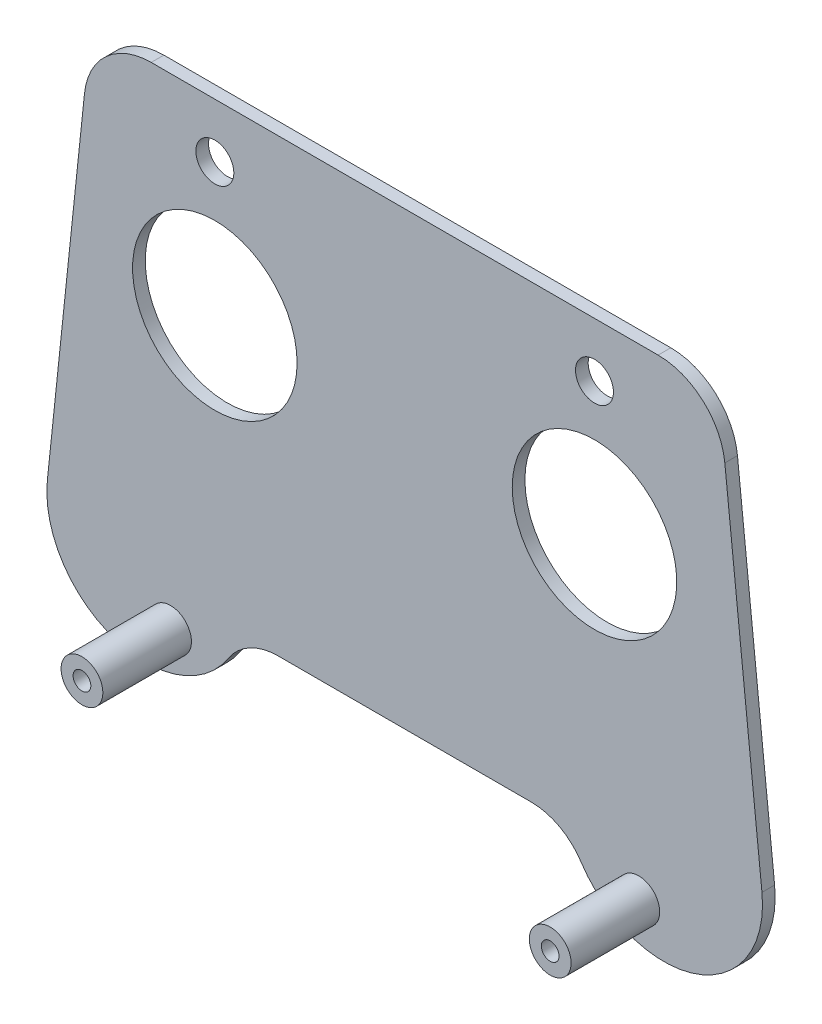
ISO-10303-21;
HEADER;
FILE_DESCRIPTION(('STEP AP214'),'2;1');
FILE_NAME('part.step','',(''),(''),'','','');
FILE_SCHEMA(('AUTOMOTIVE_DESIGN { 1 0 10303 214 1 1 1 1 }'));
ENDSEC;
DATA;
#1=APPLICATION_CONTEXT('core data for automotive mechanical design processes');
#2=APPLICATION_PROTOCOL_DEFINITION('international standard','automotive_design',2000,#1);
#3=PRODUCT_CONTEXT('',#1,'mechanical');
#4=PRODUCT('Part','Part','',(#3));
#5=PRODUCT_RELATED_PRODUCT_CATEGORY('part','',(#4));
#6=PRODUCT_DEFINITION_FORMATION('','',#4);
#7=PRODUCT_DEFINITION_CONTEXT('part definition',#1,'design');
#8=PRODUCT_DEFINITION('design','',#6,#7);
#9=PRODUCT_DEFINITION_SHAPE('','',#8);
#10=(LENGTH_UNIT() NAMED_UNIT(*) SI_UNIT(.MILLI.,.METRE.));
#11=(NAMED_UNIT(*) PLANE_ANGLE_UNIT() SI_UNIT($,.RADIAN.));
#12=(NAMED_UNIT(*) SI_UNIT($,.STERADIAN.) SOLID_ANGLE_UNIT());
#13=UNCERTAINTY_MEASURE_WITH_UNIT(LENGTH_MEASURE(1.E-05),#10,'distance_accuracy_value','');
#14=(GEOMETRIC_REPRESENTATION_CONTEXT(3) GLOBAL_UNCERTAINTY_ASSIGNED_CONTEXT((#13)) GLOBAL_UNIT_ASSIGNED_CONTEXT((#10,
#11,#12)) REPRESENTATION_CONTEXT('',''));
#15=CARTESIAN_POINT('',(0.,0.,0.));
#16=DIRECTION('',(0.,0.,1.));
#17=DIRECTION('',(1.,0.,0.));
#18=AXIS2_PLACEMENT_3D('',#15,#16,#17);
#19=CARTESIAN_POINT('',(30.5870328280948,18.8291806062269,2.));
#20=DIRECTION('',(0.,0.,1.));
#21=DIRECTION('',(1.,0.,0.));
#22=AXIS2_PLACEMENT_3D('',#19,#20,#21);
#23=PLANE('',#22);
#24=CARTESIAN_POINT('',(27.5322517817776,-46.6708193937731,2.));
#25=DIRECTION('',(0.,0.,1.));
#26=DIRECTION('',(-1.,0.,0.));
#27=AXIS2_PLACEMENT_3D('',#24,#25,#26);
#28=CIRCLE('',#27,3.3);
#29=CARTESIAN_POINT('',(24.2322517817776,-46.6708193937731,2.));
#30=VERTEX_POINT('',#29);
#31=EDGE_CURVE('E242',#30,#30,#28,.T.);
#32=ORIENTED_EDGE('',*,*,#31,.F.);
#33=EDGE_LOOP('',(#32));
#34=FACE_BOUND('',#33,.T.);
#35=CARTESIAN_POINT('',(-46.4677482182224,-46.6708193937731,2.));
#36=DIRECTION('',(0.,0.,1.));
#37=DIRECTION('',(1.,0.,0.));
#38=AXIS2_PLACEMENT_3D('',#35,#36,#37);
#39=CIRCLE('',#38,3.3);
#40=CARTESIAN_POINT('',(-43.1677482182224,-46.6708193937731,2.));
#41=VERTEX_POINT('',#40);
#42=EDGE_CURVE('E236',#41,#41,#39,.T.);
#43=ORIENTED_EDGE('',*,*,#42,.F.);
#44=EDGE_LOOP('',(#43));
#45=FACE_BOUND('',#44,.T.);
#46=CARTESIAN_POINT('',(20.5322517817776,-0.170819393773065,2.));
#47=DIRECTION('',(0.,0.,1.));
#48=DIRECTION('',(-1.,0.,0.));
#49=AXIS2_PLACEMENT_3D('',#46,#47,#48);
#50=CIRCLE('',#49,13.);
#51=CARTESIAN_POINT('',(7.53225178177759,-0.170819393773065,2.));
#52=VERTEX_POINT('',#51);
#53=EDGE_CURVE('E221',#52,#52,#50,.T.);
#54=ORIENTED_EDGE('',*,*,#53,.F.);
#55=EDGE_LOOP('',(#54));
#56=FACE_BOUND('',#55,.T.);
#57=CARTESIAN_POINT('',(-39.4677482182224,-0.170819393773072,2.));
#58=DIRECTION('',(0.,0.,1.));
#59=DIRECTION('',(1.,0.,0.));
#60=AXIS2_PLACEMENT_3D('',#57,#58,#59);
#61=CIRCLE('',#60,13.);
#62=CARTESIAN_POINT('',(-26.4677482182224,-0.170819393773072,2.));
#63=VERTEX_POINT('',#62);
#64=EDGE_CURVE('E149',#63,#63,#61,.T.);
#65=ORIENTED_EDGE('',*,*,#64,.F.);
#66=EDGE_LOOP('',(#65));
#67=FACE_BOUND('',#66,.T.);
#68=CARTESIAN_POINT('',(30.5870328280948,18.8291806062269,2.));
#69=DIRECTION('',(0.,0.,1.));
#70=DIRECTION('',(1.,0.,0.));
#71=AXIS2_PLACEMENT_3D('',#68,#69,#70);
#72=CIRCLE('',#71,10.6);
#73=CARTESIAN_POINT('',(41.1289649189985,19.937182316864,2.));
#74=VERTEX_POINT('',#73);
#75=CARTESIAN_POINT('',(30.5870328280948,29.4291806062269,2.));
#76=VERTEX_POINT('',#75);
#77=EDGE_CURVE('E164',#74,#76,#72,.T.);
#78=ORIENTED_EDGE('',*,*,#77,.T.);
#79=DIRECTION('',(-1.,0.,0.));
#80=VECTOR('',#79,1.);
#81=CARTESIAN_POINT('',(30.5870328280948,29.4291806062269,2.));
#82=LINE('',#81,#80);
#83=CARTESIAN_POINT('',(-49.5225292645397,29.4291806062269,2.));
#84=VERTEX_POINT('',#83);
#85=EDGE_CURVE('E102',#76,#84,#82,.T.);
#86=ORIENTED_EDGE('',*,*,#85,.T.);
#87=CARTESIAN_POINT('',(-49.5225292645397,18.8291806062269,2.));
#88=DIRECTION('',(0.,0.,1.));
#89=DIRECTION('',(-1.,0.,0.));
#90=AXIS2_PLACEMENT_3D('',#87,#88,#89);
#91=CIRCLE('',#90,10.6);
#92=CARTESIAN_POINT('',(-60.0644613554434,19.937182316864,2.));
#93=VERTEX_POINT('',#92);
#94=EDGE_CURVE('E185',#84,#93,#91,.T.);
#95=ORIENTED_EDGE('',*,*,#94,.T.);
#96=DIRECTION('',(-0.104528463267651,-0.994521895368274,0.));
#97=VECTOR('',#96,1.);
#98=CARTESIAN_POINT('',(-60.0644613554434,19.937182316864,2.));
#99=LINE('',#98,#97);
#100=CARTESIAN_POINT('',(-65.9331597594666,-35.8997531709289,2.));
#101=VERTEX_POINT('',#100);
#102=EDGE_CURVE('E204',#93,#101,#99,.T.);
#103=ORIENTED_EDGE('',*,*,#102,.T.);
#104=CARTESIAN_POINT('',(-50.4186181917215,-37.5303971979043,2.));
#105=DIRECTION('',(0.,0.,1.));
#106=DIRECTION('',(1.,0.,0.));
#107=AXIS2_PLACEMENT_3D('',#104,#105,#106);
#108=CIRCLE('',#107,15.6);
#109=CARTESIAN_POINT('',(-37.3452763755817,-46.0420206481264,2.));
#110=VERTEX_POINT('',#109);
#111=EDGE_CURVE('E201',#101,#110,#108,.T.);
#112=ORIENTED_EDGE('',*,*,#111,.T.);
#113=CARTESIAN_POINT('',(-29.4677498966257,-51.1708193937731,2.));
#114=DIRECTION('',(0.,0.,-1.));
#115=DIRECTION('',(1.,0.,0.));
#116=AXIS2_PLACEMENT_3D('',#113,#114,#115);
#117=CIRCLE('',#116,9.40000000000001);
#118=CARTESIAN_POINT('',(-29.4677498966257,-41.7708193937731,2.));
#119=VERTEX_POINT('',#118);
#120=EDGE_CURVE('E203',#110,#119,#117,.T.);
#121=ORIENTED_EDGE('',*,*,#120,.T.);
#122=DIRECTION('',(1.,0.,0.));
#123=VECTOR('',#122,1.);
#124=CARTESIAN_POINT('',(-29.4677498966257,-41.7708193937731,2.));
#125=LINE('',#124,#123);
#126=CARTESIAN_POINT('',(10.5322534601809,-41.7708193937731,2.));
#127=VERTEX_POINT('',#126);
#128=EDGE_CURVE('E127',#119,#127,#125,.T.);
#129=ORIENTED_EDGE('',*,*,#128,.T.);
#130=CARTESIAN_POINT('',(10.5322534601809,-51.1708193937731,2.));
#131=DIRECTION('',(0.,0.,-1.));
#132=DIRECTION('',(-1.,0.,0.));
#133=AXIS2_PLACEMENT_3D('',#130,#131,#132);
#134=CIRCLE('',#133,9.40000000000001);
#135=CARTESIAN_POINT('',(18.4097799391369,-46.0420206481264,2.));
#136=VERTEX_POINT('',#135);
#137=EDGE_CURVE('E121',#127,#136,#134,.T.);
#138=ORIENTED_EDGE('',*,*,#137,.T.);
#139=CARTESIAN_POINT('',(31.4831217552767,-37.5303971979043,2.));
#140=DIRECTION('',(0.,0.,1.));
#141=DIRECTION('',(-1.,0.,0.));
#142=AXIS2_PLACEMENT_3D('',#139,#140,#141);
#143=CIRCLE('',#142,15.6);
#144=CARTESIAN_POINT('',(46.9976633230217,-35.8997531709289,2.));
#145=VERTEX_POINT('',#144);
#146=EDGE_CURVE('E125',#136,#145,#143,.T.);
#147=ORIENTED_EDGE('',*,*,#146,.T.);
#148=DIRECTION('',(-0.104528463267651,0.994521895368274,0.));
#149=VECTOR('',#148,1.);
#150=CARTESIAN_POINT('',(41.1289649189985,19.937182316864,2.));
#151=LINE('',#150,#149);
#152=EDGE_CURVE('E53',#145,#74,#151,.T.);
#153=ORIENTED_EDGE('',*,*,#152,.T.);
#154=EDGE_LOOP('',(#78,#86,#95,#103,#112,#121,#129,#138,#147,#153));
#155=FACE_BOUND('',#154,.T.);
#156=CARTESIAN_POINT('',(-39.4677482182224,20.8291806062269,2.));
#157=DIRECTION('',(0.,0.,1.));
#158=DIRECTION('',(1.,0.,0.));
#159=AXIS2_PLACEMENT_3D('',#156,#157,#158);
#160=CIRCLE('',#159,3.);
#161=CARTESIAN_POINT('',(-36.4677482182224,20.8291806062269,2.));
#162=VERTEX_POINT('',#161);
#163=EDGE_CURVE('E215',#162,#162,#160,.T.);
#164=ORIENTED_EDGE('',*,*,#163,.F.);
#165=EDGE_LOOP('',(#164));
#166=FACE_BOUND('',#165,.T.);
#167=CARTESIAN_POINT('',(20.5322517817776,20.8291806062269,2.));
#168=DIRECTION('',(0.,0.,1.));
#169=DIRECTION('',(-1.,0.,0.));
#170=AXIS2_PLACEMENT_3D('',#167,#168,#169);
#171=CIRCLE('',#170,3.);
#172=CARTESIAN_POINT('',(17.5322517817776,20.8291806062269,2.));
#173=VERTEX_POINT('',#172);
#174=EDGE_CURVE('E227',#173,#173,#171,.T.);
#175=ORIENTED_EDGE('',*,*,#174,.F.);
#176=EDGE_LOOP('',(#175));
#177=FACE_BOUND('',#176,.T.);
#178=ADVANCED_FACE('F36',(#34,#45,#56,#67,#155,#166,#177),#23,.T.);
#179=CARTESIAN_POINT('',(30.5870328280948,18.8291806062269,0.));
#180=DIRECTION('',(0.,0.,1.));
#181=DIRECTION('',(1.,0.,0.));
#182=AXIS2_PLACEMENT_3D('',#179,#180,#181);
#183=PLANE('',#182);
#184=CARTESIAN_POINT('',(30.5870328280948,18.8291806062269,0.));
#185=DIRECTION('',(0.,0.,1.));
#186=DIRECTION('',(1.,0.,0.));
#187=AXIS2_PLACEMENT_3D('',#184,#185,#186);
#188=CIRCLE('',#187,10.6);
#189=CARTESIAN_POINT('',(41.1289649189985,19.937182316864,0.));
#190=VERTEX_POINT('',#189);
#191=CARTESIAN_POINT('',(30.5870328280948,29.4291806062269,0.));
#192=VERTEX_POINT('',#191);
#193=EDGE_CURVE('E145',#190,#192,#188,.T.);
#194=ORIENTED_EDGE('',*,*,#193,.F.);
#195=DIRECTION('',(-0.104528463267651,0.994521895368274,0.));
#196=VECTOR('',#195,1.);
#197=CARTESIAN_POINT('',(41.1289649189985,19.937182316864,0.));
#198=LINE('',#197,#196);
#199=CARTESIAN_POINT('',(46.9976633230217,-35.8997531709289,0.));
#200=VERTEX_POINT('',#199);
#201=EDGE_CURVE('E94',#200,#190,#198,.T.);
#202=ORIENTED_EDGE('',*,*,#201,.F.);
#203=CARTESIAN_POINT('',(31.4831217552767,-37.5303971979043,0.));
#204=DIRECTION('',(0.,0.,1.));
#205=DIRECTION('',(-1.,0.,0.));
#206=AXIS2_PLACEMENT_3D('',#203,#204,#205);
#207=CIRCLE('',#206,15.6);
#208=CARTESIAN_POINT('',(18.4097799391369,-46.0420206481264,0.));
#209=VERTEX_POINT('',#208);
#210=EDGE_CURVE('E88',#209,#200,#207,.T.);
#211=ORIENTED_EDGE('',*,*,#210,.F.);
#212=CARTESIAN_POINT('',(10.5322534601809,-51.1708193937731,0.));
#213=DIRECTION('',(0.,0.,-1.));
#214=DIRECTION('',(-1.,0.,0.));
#215=AXIS2_PLACEMENT_3D('',#212,#213,#214);
#216=CIRCLE('',#215,9.40000000000001);
#217=CARTESIAN_POINT('',(10.5322534601809,-41.7708193937731,0.));
#218=VERTEX_POINT('',#217);
#219=EDGE_CURVE('E135',#218,#209,#216,.T.);
#220=ORIENTED_EDGE('',*,*,#219,.F.);
#221=DIRECTION('',(1.,0.,0.));
#222=VECTOR('',#221,1.);
#223=CARTESIAN_POINT('',(-29.4677498966257,-41.7708193937731,0.));
#224=LINE('',#223,#222);
#225=CARTESIAN_POINT('',(-29.4677498966257,-41.7708193937731,0.));
#226=VERTEX_POINT('',#225);
#227=EDGE_CURVE('E159',#226,#218,#224,.T.);
#228=ORIENTED_EDGE('',*,*,#227,.F.);
#229=CARTESIAN_POINT('',(-29.4677498966257,-51.1708193937731,0.));
#230=DIRECTION('',(0.,0.,-1.));
#231=DIRECTION('',(1.,0.,0.));
#232=AXIS2_PLACEMENT_3D('',#229,#230,#231);
#233=CIRCLE('',#232,9.40000000000001);
#234=CARTESIAN_POINT('',(-37.3452763755817,-46.0420206481264,0.));
#235=VERTEX_POINT('',#234);
#236=EDGE_CURVE('E157',#235,#226,#233,.T.);
#237=ORIENTED_EDGE('',*,*,#236,.F.);
#238=CARTESIAN_POINT('',(-50.4186181917215,-37.5303971979043,0.));
#239=DIRECTION('',(0.,0.,1.));
#240=DIRECTION('',(1.,0.,0.));
#241=AXIS2_PLACEMENT_3D('',#238,#239,#240);
#242=CIRCLE('',#241,15.6);
#243=CARTESIAN_POINT('',(-65.9331597594666,-35.8997531709289,0.));
#244=VERTEX_POINT('',#243);
#245=EDGE_CURVE('E155',#244,#235,#242,.T.);
#246=ORIENTED_EDGE('',*,*,#245,.F.);
#247=DIRECTION('',(-0.104528463267651,-0.994521895368274,0.));
#248=VECTOR('',#247,1.);
#249=CARTESIAN_POINT('',(-60.0644613554434,19.937182316864,0.));
#250=LINE('',#249,#248);
#251=CARTESIAN_POINT('',(-60.0644613554434,19.937182316864,0.));
#252=VERTEX_POINT('',#251);
#253=EDGE_CURVE('E153',#252,#244,#250,.T.);
#254=ORIENTED_EDGE('',*,*,#253,.F.);
#255=CARTESIAN_POINT('',(-49.5225292645397,18.8291806062269,0.));
#256=DIRECTION('',(0.,0.,1.));
#257=DIRECTION('',(-1.,0.,0.));
#258=AXIS2_PLACEMENT_3D('',#255,#256,#257);
#259=CIRCLE('',#258,10.6);
#260=CARTESIAN_POINT('',(-49.5225292645397,29.4291806062269,0.));
#261=VERTEX_POINT('',#260);
#262=EDGE_CURVE('E151',#261,#252,#259,.T.);
#263=ORIENTED_EDGE('',*,*,#262,.F.);
#264=DIRECTION('',(-1.,0.,0.));
#265=VECTOR('',#264,1.);
#266=CARTESIAN_POINT('',(30.5870328280948,29.4291806062269,0.));
#267=LINE('',#266,#265);
#268=EDGE_CURVE('E148',#192,#261,#267,.T.);
#269=ORIENTED_EDGE('',*,*,#268,.F.);
#270=EDGE_LOOP('',(#194,#202,#211,#220,#228,#237,#246,#254,#263,#269));
#271=FACE_BOUND('',#270,.T.);
#272=CARTESIAN_POINT('',(-39.4677482182224,-0.170819393773072,0.));
#273=DIRECTION('',(0.,0.,1.));
#274=DIRECTION('',(1.,0.,0.));
#275=AXIS2_PLACEMENT_3D('',#272,#273,#274);
#276=CIRCLE('',#275,13.);
#277=CARTESIAN_POINT('',(-26.4677482182224,-0.170819393773072,0.));
#278=VERTEX_POINT('',#277);
#279=EDGE_CURVE('E212',#278,#278,#276,.T.);
#280=ORIENTED_EDGE('',*,*,#279,.T.);
#281=EDGE_LOOP('',(#280));
#282=FACE_BOUND('',#281,.T.);
#283=CARTESIAN_POINT('',(-39.4677482182224,20.8291806062269,0.));
#284=DIRECTION('',(0.,0.,1.));
#285=DIRECTION('',(1.,0.,0.));
#286=AXIS2_PLACEMENT_3D('',#283,#284,#285);
#287=CIRCLE('',#286,3.);
#288=CARTESIAN_POINT('',(-36.4677482182224,20.8291806062269,0.));
#289=VERTEX_POINT('',#288);
#290=EDGE_CURVE('E218',#289,#289,#287,.T.);
#291=ORIENTED_EDGE('',*,*,#290,.T.);
#292=EDGE_LOOP('',(#291));
#293=FACE_BOUND('',#292,.T.);
#294=CARTESIAN_POINT('',(20.5322517817776,-0.170819393773065,0.));
#295=DIRECTION('',(0.,0.,1.));
#296=DIRECTION('',(-1.,0.,0.));
#297=AXIS2_PLACEMENT_3D('',#294,#295,#296);
#298=CIRCLE('',#297,13.);
#299=CARTESIAN_POINT('',(7.53225178177759,-0.170819393773065,0.));
#300=VERTEX_POINT('',#299);
#301=EDGE_CURVE('E224',#300,#300,#298,.T.);
#302=ORIENTED_EDGE('',*,*,#301,.T.);
#303=EDGE_LOOP('',(#302));
#304=FACE_BOUND('',#303,.T.);
#305=CARTESIAN_POINT('',(20.5322517817776,20.8291806062269,0.));
#306=DIRECTION('',(0.,0.,1.));
#307=DIRECTION('',(-1.,0.,0.));
#308=AXIS2_PLACEMENT_3D('',#305,#306,#307);
#309=CIRCLE('',#308,3.);
#310=CARTESIAN_POINT('',(17.5322517817776,20.8291806062269,0.));
#311=VERTEX_POINT('',#310);
#312=EDGE_CURVE('E230',#311,#311,#309,.T.);
#313=ORIENTED_EDGE('',*,*,#312,.T.);
#314=EDGE_LOOP('',(#313));
#315=FACE_BOUND('',#314,.T.);
#316=ADVANCED_FACE('F189',(#271,#282,#293,#304,#315),#183,.F.);
#317=CARTESIAN_POINT('',(30.5870328280948,18.8291806062269,2.));
#318=DIRECTION('',(0.,0.,-1.));
#319=DIRECTION('',(-1.,0.,0.));
#320=AXIS2_PLACEMENT_3D('',#317,#318,#319);
#321=CYLINDRICAL_SURFACE('',#320,10.6);
#322=ORIENTED_EDGE('',*,*,#193,.T.);
#323=DIRECTION('',(0.,0.,-1.));
#324=VECTOR('',#323,1.);
#325=CARTESIAN_POINT('',(30.5870328280948,29.4291806062269,2.));
#326=LINE('',#325,#324);
#327=EDGE_CURVE('E11',#76,#192,#326,.T.);
#328=ORIENTED_EDGE('',*,*,#327,.F.);
#329=ORIENTED_EDGE('',*,*,#77,.F.);
#330=DIRECTION('',(0.,0.,-1.));
#331=VECTOR('',#330,1.);
#332=CARTESIAN_POINT('',(41.1289649189985,19.937182316864,2.));
#333=LINE('',#332,#331);
#334=EDGE_CURVE('E141',#74,#190,#333,.T.);
#335=ORIENTED_EDGE('',*,*,#334,.T.);
#336=EDGE_LOOP('',(#322,#328,#329,#335));
#337=FACE_BOUND('',#336,.T.);
#338=ADVANCED_FACE('F38',(#337),#321,.T.);
#339=CARTESIAN_POINT('',(30.5870328280948,29.4291806062269,2.));
#340=DIRECTION('',(0.,-1.,0.));
#341=DIRECTION('',(0.,0.,-1.));
#342=AXIS2_PLACEMENT_3D('',#339,#340,#341);
#343=PLANE('',#342);
#344=ORIENTED_EDGE('',*,*,#268,.T.);
#345=DIRECTION('',(0.,0.,-1.));
#346=VECTOR('',#345,1.);
#347=CARTESIAN_POINT('',(-49.5225292645397,29.4291806062269,2.));
#348=LINE('',#347,#346);
#349=EDGE_CURVE('E45',#84,#261,#348,.T.);
#350=ORIENTED_EDGE('',*,*,#349,.F.);
#351=ORIENTED_EDGE('',*,*,#85,.F.);
#352=ORIENTED_EDGE('',*,*,#327,.T.);
#353=EDGE_LOOP('',(#344,#350,#351,#352));
#354=FACE_BOUND('',#353,.T.);
#355=ADVANCED_FACE('F339',(#354),#343,.F.);
#356=CARTESIAN_POINT('',(-49.5225292645397,18.8291806062269,2.));
#357=DIRECTION('',(0.,0.,-1.));
#358=DIRECTION('',(-1.,0.,0.));
#359=AXIS2_PLACEMENT_3D('',#356,#357,#358);
#360=CYLINDRICAL_SURFACE('',#359,10.6);
#361=ORIENTED_EDGE('',*,*,#262,.T.);
#362=DIRECTION('',(0.,0.,-1.));
#363=VECTOR('',#362,1.);
#364=CARTESIAN_POINT('',(-60.0644613554434,19.937182316864,2.));
#365=LINE('',#364,#363);
#366=EDGE_CURVE('E177',#93,#252,#365,.T.);
#367=ORIENTED_EDGE('',*,*,#366,.F.);
#368=ORIENTED_EDGE('',*,*,#94,.F.);
#369=ORIENTED_EDGE('',*,*,#349,.T.);
#370=EDGE_LOOP('',(#361,#367,#368,#369));
#371=FACE_BOUND('',#370,.T.);
#372=ADVANCED_FACE('F183',(#371),#360,.T.);
#373=CARTESIAN_POINT('',(-60.0644613554434,19.937182316864,2.));
#374=DIRECTION('',(0.994521895368274,-0.104528463267651,0.));
#375=DIRECTION('',(0.104528463267651,0.994521895368274,0.));
#376=AXIS2_PLACEMENT_3D('',#373,#374,#375);
#377=PLANE('',#376);
#378=ORIENTED_EDGE('',*,*,#253,.T.);
#379=DIRECTION('',(0.,0.,-1.));
#380=VECTOR('',#379,1.);
#381=CARTESIAN_POINT('',(-65.9331597594666,-35.8997531709289,2.));
#382=LINE('',#381,#380);
#383=EDGE_CURVE('E174',#101,#244,#382,.T.);
#384=ORIENTED_EDGE('',*,*,#383,.F.);
#385=ORIENTED_EDGE('',*,*,#102,.F.);
#386=ORIENTED_EDGE('',*,*,#366,.T.);
#387=EDGE_LOOP('',(#378,#384,#385,#386));
#388=FACE_BOUND('',#387,.T.);
#389=ADVANCED_FACE('F195',(#388),#377,.F.);
#390=CARTESIAN_POINT('',(-50.4186181917215,-37.5303971979043,2.));
#391=DIRECTION('',(0.,0.,-1.));
#392=DIRECTION('',(-1.,0.,0.));
#393=AXIS2_PLACEMENT_3D('',#390,#391,#392);
#394=CYLINDRICAL_SURFACE('',#393,15.6);
#395=ORIENTED_EDGE('',*,*,#245,.T.);
#396=DIRECTION('',(0.,0.,-1.));
#397=VECTOR('',#396,1.);
#398=CARTESIAN_POINT('',(-37.3452763755817,-46.0420206481264,2.));
#399=LINE('',#398,#397);
#400=EDGE_CURVE('E171',#110,#235,#399,.T.);
#401=ORIENTED_EDGE('',*,*,#400,.F.);
#402=ORIENTED_EDGE('',*,*,#111,.F.);
#403=ORIENTED_EDGE('',*,*,#383,.T.);
#404=EDGE_LOOP('',(#395,#401,#402,#403));
#405=FACE_BOUND('',#404,.T.);
#406=ADVANCED_FACE('F199',(#405),#394,.T.);
#407=CARTESIAN_POINT('',(-29.4677498966257,-51.1708193937731,2.));
#408=DIRECTION('',(0.,0.,-1.));
#409=DIRECTION('',(-1.,0.,0.));
#410=AXIS2_PLACEMENT_3D('',#407,#408,#409);
#411=CYLINDRICAL_SURFACE('',#410,9.40000000000001);
#412=ORIENTED_EDGE('',*,*,#236,.T.);
#413=DIRECTION('',(0.,0.,-1.));
#414=VECTOR('',#413,1.);
#415=CARTESIAN_POINT('',(-29.4677498966257,-41.7708193937731,2.));
#416=LINE('',#415,#414);
#417=EDGE_CURVE('E168',#119,#226,#416,.T.);
#418=ORIENTED_EDGE('',*,*,#417,.F.);
#419=ORIENTED_EDGE('',*,*,#120,.F.);
#420=ORIENTED_EDGE('',*,*,#400,.T.);
#421=EDGE_LOOP('',(#412,#418,#419,#420));
#422=FACE_BOUND('',#421,.T.);
#423=ADVANCED_FACE('F329',(#422),#411,.F.);
#424=CARTESIAN_POINT('',(-29.4677498966257,-41.7708193937731,2.));
#425=DIRECTION('',(0.,1.,0.));
#426=DIRECTION('',(-1.,0.,0.));
#427=AXIS2_PLACEMENT_3D('',#424,#425,#426);
#428=PLANE('',#427);
#429=ORIENTED_EDGE('',*,*,#227,.T.);
#430=DIRECTION('',(0.,0.,-1.));
#431=VECTOR('',#430,1.);
#432=CARTESIAN_POINT('',(10.5322534601809,-41.7708193937731,2.));
#433=LINE('',#432,#431);
#434=EDGE_CURVE('E136',#127,#218,#433,.T.);
#435=ORIENTED_EDGE('',*,*,#434,.F.);
#436=ORIENTED_EDGE('',*,*,#128,.F.);
#437=ORIENTED_EDGE('',*,*,#417,.T.);
#438=EDGE_LOOP('',(#429,#435,#436,#437));
#439=FACE_BOUND('',#438,.T.);
#440=ADVANCED_FACE('F326',(#439),#428,.F.);
#441=CARTESIAN_POINT('',(10.5322534601809,-51.1708193937731,2.));
#442=DIRECTION('',(0.,0.,-1.));
#443=DIRECTION('',(-1.,0.,0.));
#444=AXIS2_PLACEMENT_3D('',#441,#442,#443);
#445=CYLINDRICAL_SURFACE('',#444,9.40000000000001);
#446=ORIENTED_EDGE('',*,*,#219,.T.);
#447=DIRECTION('',(0.,0.,-1.));
#448=VECTOR('',#447,1.);
#449=CARTESIAN_POINT('',(18.4097799391369,-46.0420206481264,2.));
#450=LINE('',#449,#448);
#451=EDGE_CURVE('E132',#136,#209,#450,.T.);
#452=ORIENTED_EDGE('',*,*,#451,.F.);
#453=ORIENTED_EDGE('',*,*,#137,.F.);
#454=ORIENTED_EDGE('',*,*,#434,.T.);
#455=EDGE_LOOP('',(#446,#452,#453,#454));
#456=FACE_BOUND('',#455,.T.);
#457=ADVANCED_FACE('F133',(#456),#445,.F.);
#458=CARTESIAN_POINT('',(31.4831217552767,-37.5303971979043,2.));
#459=DIRECTION('',(0.,0.,-1.));
#460=DIRECTION('',(-1.,0.,0.));
#461=AXIS2_PLACEMENT_3D('',#458,#459,#460);
#462=CYLINDRICAL_SURFACE('',#461,15.6);
#463=ORIENTED_EDGE('',*,*,#210,.T.);
#464=DIRECTION('',(0.,0.,-1.));
#465=VECTOR('',#464,1.);
#466=CARTESIAN_POINT('',(46.9976633230217,-35.8997531709289,2.));
#467=LINE('',#466,#465);
#468=EDGE_CURVE('E137',#145,#200,#467,.T.);
#469=ORIENTED_EDGE('',*,*,#468,.F.);
#470=ORIENTED_EDGE('',*,*,#146,.F.);
#471=ORIENTED_EDGE('',*,*,#451,.T.);
#472=EDGE_LOOP('',(#463,#469,#470,#471));
#473=FACE_BOUND('',#472,.T.);
#474=ADVANCED_FACE('F139',(#473),#462,.T.);
#475=CARTESIAN_POINT('',(41.1289649189985,19.937182316864,2.));
#476=DIRECTION('',(-0.994521895368274,-0.104528463267651,0.));
#477=DIRECTION('',(0.104528463267651,-0.994521895368274,0.));
#478=AXIS2_PLACEMENT_3D('',#475,#476,#477);
#479=PLANE('',#478);
#480=ORIENTED_EDGE('',*,*,#201,.T.);
#481=ORIENTED_EDGE('',*,*,#334,.F.);
#482=ORIENTED_EDGE('',*,*,#152,.F.);
#483=ORIENTED_EDGE('',*,*,#468,.T.);
#484=EDGE_LOOP('',(#480,#481,#482,#483));
#485=FACE_BOUND('',#484,.T.);
#486=ADVANCED_FACE('F295',(#485),#479,.F.);
#487=CARTESIAN_POINT('',(-39.4677482182224,-0.170819393773072,2.));
#488=DIRECTION('',(0.,0.,-1.));
#489=DIRECTION('',(-1.,0.,0.));
#490=AXIS2_PLACEMENT_3D('',#487,#488,#489);
#491=CYLINDRICAL_SURFACE('',#490,13.);
#492=ORIENTED_EDGE('',*,*,#64,.T.);
#493=EDGE_LOOP('',(#492));
#494=FACE_BOUND('',#493,.T.);
#495=ORIENTED_EDGE('',*,*,#279,.F.);
#496=EDGE_LOOP('',(#495));
#497=FACE_BOUND('',#496,.T.);
#498=ADVANCED_FACE('F291',(#494,#497),#491,.F.);
#499=CARTESIAN_POINT('',(-39.4677482182224,20.8291806062269,2.));
#500=DIRECTION('',(0.,0.,-1.));
#501=DIRECTION('',(-1.,0.,0.));
#502=AXIS2_PLACEMENT_3D('',#499,#500,#501);
#503=CYLINDRICAL_SURFACE('',#502,3.);
#504=ORIENTED_EDGE('',*,*,#163,.T.);
#505=EDGE_LOOP('',(#504));
#506=FACE_BOUND('',#505,.T.);
#507=ORIENTED_EDGE('',*,*,#290,.F.);
#508=EDGE_LOOP('',(#507));
#509=FACE_BOUND('',#508,.T.);
#510=ADVANCED_FACE('F294',(#506,#509),#503,.F.);
#511=CARTESIAN_POINT('',(20.5322517817776,-0.170819393773065,2.));
#512=DIRECTION('',(0.,0.,-1.));
#513=DIRECTION('',(-1.,0.,0.));
#514=AXIS2_PLACEMENT_3D('',#511,#512,#513);
#515=CYLINDRICAL_SURFACE('',#514,13.);
#516=ORIENTED_EDGE('',*,*,#53,.T.);
#517=EDGE_LOOP('',(#516));
#518=FACE_BOUND('',#517,.T.);
#519=ORIENTED_EDGE('',*,*,#301,.F.);
#520=EDGE_LOOP('',(#519));
#521=FACE_BOUND('',#520,.T.);
#522=ADVANCED_FACE('F308',(#518,#521),#515,.F.);
#523=CARTESIAN_POINT('',(20.5322517817776,20.8291806062269,2.));
#524=DIRECTION('',(0.,0.,-1.));
#525=DIRECTION('',(-1.,0.,0.));
#526=AXIS2_PLACEMENT_3D('',#523,#524,#525);
#527=CYLINDRICAL_SURFACE('',#526,3.);
#528=ORIENTED_EDGE('',*,*,#174,.T.);
#529=EDGE_LOOP('',(#528));
#530=FACE_BOUND('',#529,.T.);
#531=ORIENTED_EDGE('',*,*,#312,.F.);
#532=EDGE_LOOP('',(#531));
#533=FACE_BOUND('',#532,.T.);
#534=ADVANCED_FACE('F279',(#530,#533),#527,.F.);
#535=CARTESIAN_POINT('',(-46.4677482182224,-46.6708193937731,16.));
#536=DIRECTION('',(0.,0.,-1.));
#537=DIRECTION('',(-1.,0.,0.));
#538=AXIS2_PLACEMENT_3D('',#535,#536,#537);
#539=CYLINDRICAL_SURFACE('',#538,3.3);
#540=CARTESIAN_POINT('',(-46.4677482182224,-46.6708193937731,16.));
#541=DIRECTION('',(0.,0.,1.));
#542=DIRECTION('',(1.,0.,0.));
#543=AXIS2_PLACEMENT_3D('',#540,#541,#542);
#544=CIRCLE('',#543,3.3);
#545=CARTESIAN_POINT('',(-43.1677482182224,-46.6708193937731,16.));
#546=VERTEX_POINT('',#545);
#547=EDGE_CURVE('E233',#546,#546,#544,.T.);
#548=ORIENTED_EDGE('',*,*,#547,.F.);
#549=EDGE_LOOP('',(#548));
#550=FACE_BOUND('',#549,.T.);
#551=ORIENTED_EDGE('',*,*,#42,.T.);
#552=EDGE_LOOP('',(#551));
#553=FACE_BOUND('',#552,.T.);
#554=ADVANCED_FACE('F273',(#550,#553),#539,.T.);
#555=CARTESIAN_POINT('',(-46.4677482182224,-46.6708193937731,16.));
#556=DIRECTION('',(0.,0.,1.));
#557=DIRECTION('',(1.,0.,0.));
#558=AXIS2_PLACEMENT_3D('',#555,#556,#557);
#559=PLANE('',#558);
#560=CARTESIAN_POINT('',(-46.4677482182224,-46.6708193937731,16.));
#561=DIRECTION('',(0.,0.,1.));
#562=DIRECTION('',(1.,0.,0.));
#563=AXIS2_PLACEMENT_3D('',#560,#561,#562);
#564=CIRCLE('',#563,1.4);
#565=CARTESIAN_POINT('',(-45.0677482182224,-46.6708193937731,16.));
#566=VERTEX_POINT('',#565);
#567=EDGE_CURVE('E254',#566,#566,#564,.T.);
#568=ORIENTED_EDGE('',*,*,#567,.F.);
#569=EDGE_LOOP('',(#568));
#570=FACE_BOUND('',#569,.T.);
#571=ORIENTED_EDGE('',*,*,#547,.T.);
#572=EDGE_LOOP('',(#571));
#573=FACE_BOUND('',#572,.T.);
#574=ADVANCED_FACE('F269',(#570,#573),#559,.T.);
#575=CARTESIAN_POINT('',(27.5322517817776,-46.6708193937731,16.));
#576=DIRECTION('',(0.,0.,-1.));
#577=DIRECTION('',(-1.,0.,0.));
#578=AXIS2_PLACEMENT_3D('',#575,#576,#577);
#579=CYLINDRICAL_SURFACE('',#578,3.3);
#580=CARTESIAN_POINT('',(27.5322517817776,-46.6708193937731,16.));
#581=DIRECTION('',(0.,0.,1.));
#582=DIRECTION('',(-1.,0.,0.));
#583=AXIS2_PLACEMENT_3D('',#580,#581,#582);
#584=CIRCLE('',#583,3.3);
#585=CARTESIAN_POINT('',(24.2322517817776,-46.6708193937731,16.));
#586=VERTEX_POINT('',#585);
#587=EDGE_CURVE('E239',#586,#586,#584,.T.);
#588=ORIENTED_EDGE('',*,*,#587,.F.);
#589=EDGE_LOOP('',(#588));
#590=FACE_BOUND('',#589,.T.);
#591=ORIENTED_EDGE('',*,*,#31,.T.);
#592=EDGE_LOOP('',(#591));
#593=FACE_BOUND('',#592,.T.);
#594=ADVANCED_FACE('F272',(#590,#593),#579,.T.);
#595=CARTESIAN_POINT('',(27.5322517817776,-46.6708193937731,16.));
#596=DIRECTION('',(0.,0.,-1.));
#597=DIRECTION('',(-1.,0.,0.));
#598=AXIS2_PLACEMENT_3D('',#595,#596,#597);
#599=PLANE('',#598);
#600=CARTESIAN_POINT('',(27.5322517817776,-46.6708193937731,16.));
#601=DIRECTION('',(0.,0.,1.));
#602=DIRECTION('',(-1.,0.,0.));
#603=AXIS2_PLACEMENT_3D('',#600,#601,#602);
#604=CIRCLE('',#603,1.4);
#605=CARTESIAN_POINT('',(26.1322517817776,-46.6708193937731,16.));
#606=VERTEX_POINT('',#605);
#607=EDGE_CURVE('E248',#606,#606,#604,.T.);
#608=ORIENTED_EDGE('',*,*,#607,.F.);
#609=EDGE_LOOP('',(#608));
#610=FACE_BOUND('',#609,.T.);
#611=ORIENTED_EDGE('',*,*,#587,.T.);
#612=EDGE_LOOP('',(#611));
#613=FACE_BOUND('',#612,.T.);
#614=ADVANCED_FACE('F378',(#610,#613),#599,.F.);
#615=CARTESIAN_POINT('',(27.5322517817776,-46.6708193937731,6.));
#616=DIRECTION('',(0.,0.,1.));
#617=DIRECTION('',(1.,0.,0.));
#618=AXIS2_PLACEMENT_3D('',#615,#616,#617);
#619=CYLINDRICAL_SURFACE('',#618,1.4);
#620=CARTESIAN_POINT('',(27.5322517817776,-46.6708193937731,6.));
#621=DIRECTION('',(0.,0.,1.));
#622=DIRECTION('',(-1.,0.,0.));
#623=AXIS2_PLACEMENT_3D('',#620,#621,#622);
#624=CIRCLE('',#623,1.4);
#625=CARTESIAN_POINT('',(26.1322517817776,-46.6708193937731,6.));
#626=VERTEX_POINT('',#625);
#627=EDGE_CURVE('E251',#626,#626,#624,.T.);
#628=ORIENTED_EDGE('',*,*,#627,.F.);
#629=EDGE_LOOP('',(#628));
#630=FACE_BOUND('',#629,.T.);
#631=ORIENTED_EDGE('',*,*,#607,.T.);
#632=EDGE_LOOP('',(#631));
#633=FACE_BOUND('',#632,.T.);
#634=ADVANCED_FACE('F393',(#630,#633),#619,.F.);
#635=CARTESIAN_POINT('',(27.5322517817776,-46.6708193937731,6.));
#636=DIRECTION('',(0.,0.,-1.));
#637=DIRECTION('',(-1.,0.,0.));
#638=AXIS2_PLACEMENT_3D('',#635,#636,#637);
#639=PLANE('',#638);
#640=ORIENTED_EDGE('',*,*,#627,.T.);
#641=EDGE_LOOP('',(#640));
#642=FACE_BOUND('',#641,.T.);
#643=ADVANCED_FACE('F265',(#642),#639,.F.);
#644=CARTESIAN_POINT('',(-46.4677482182224,-46.6708193937731,6.));
#645=DIRECTION('',(0.,0.,1.));
#646=DIRECTION('',(1.,0.,0.));
#647=AXIS2_PLACEMENT_3D('',#644,#645,#646);
#648=CYLINDRICAL_SURFACE('',#647,1.4);
#649=CARTESIAN_POINT('',(-46.4677482182224,-46.6708193937731,6.));
#650=DIRECTION('',(0.,0.,1.));
#651=DIRECTION('',(1.,0.,0.));
#652=AXIS2_PLACEMENT_3D('',#649,#650,#651);
#653=CIRCLE('',#652,1.4);
#654=CARTESIAN_POINT('',(-45.0677482182224,-46.6708193937731,6.));
#655=VERTEX_POINT('',#654);
#656=EDGE_CURVE('E245',#655,#655,#653,.T.);
#657=ORIENTED_EDGE('',*,*,#656,.F.);
#658=EDGE_LOOP('',(#657));
#659=FACE_BOUND('',#658,.T.);
#660=ORIENTED_EDGE('',*,*,#567,.T.);
#661=EDGE_LOOP('',(#660));
#662=FACE_BOUND('',#661,.T.);
#663=ADVANCED_FACE('F262',(#659,#662),#648,.F.);
#664=CARTESIAN_POINT('',(-46.4677482182224,-46.6708193937731,6.));
#665=DIRECTION('',(0.,0.,1.));
#666=DIRECTION('',(1.,0.,0.));
#667=AXIS2_PLACEMENT_3D('',#664,#665,#666);
#668=PLANE('',#667);
#669=ORIENTED_EDGE('',*,*,#656,.T.);
#670=EDGE_LOOP('',(#669));
#671=FACE_BOUND('',#670,.T.);
#672=ADVANCED_FACE('F260',(#671),#668,.T.);
#673=CLOSED_SHELL('',(#178,#316,#338,#355,#372,#389,#406,#423,#440,#457,#474,#486,#498,#510,
#522,#534,#554,#574,#594,#614,#634,#643,#663,#672));
#674=MANIFOLD_SOLID_BREP('B2',#673);
#675=ADVANCED_BREP_SHAPE_REPRESENTATION('',(#18,#674),#14);
#676=SHAPE_DEFINITION_REPRESENTATION(#9,#675);
ENDSEC;
END-ISO-10303-21;
